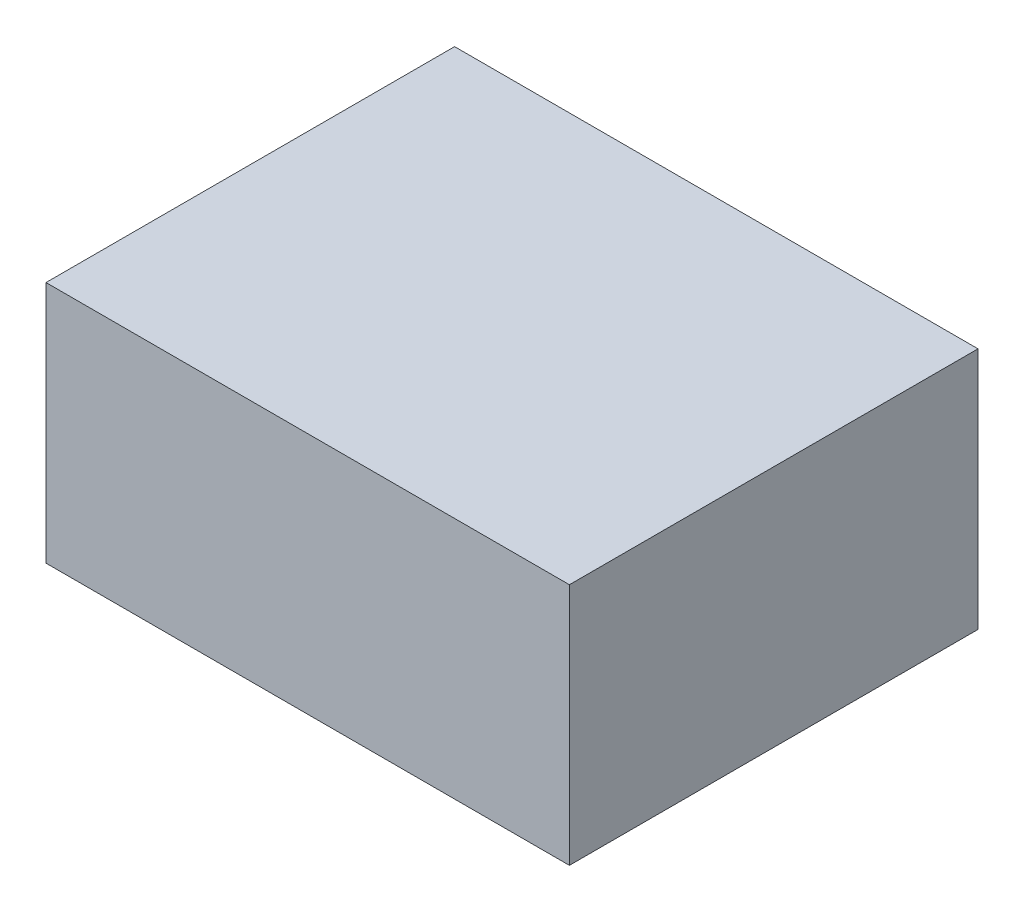
ISO-10303-21;
HEADER;
FILE_DESCRIPTION(('STEP AP214'),'2;1');
FILE_NAME('part.step','',(''),(''),'','','');
FILE_SCHEMA(('AUTOMOTIVE_DESIGN { 1 0 10303 214 1 1 1 1 }'));
ENDSEC;
DATA;
#1=APPLICATION_CONTEXT('core data for automotive mechanical design processes');
#2=APPLICATION_PROTOCOL_DEFINITION('international standard','automotive_design',2000,#1);
#3=PRODUCT_CONTEXT('',#1,'mechanical');
#4=PRODUCT('Part','Part','',(#3));
#5=PRODUCT_RELATED_PRODUCT_CATEGORY('part','',(#4));
#6=PRODUCT_DEFINITION_FORMATION('','',#4);
#7=PRODUCT_DEFINITION_CONTEXT('part definition',#1,'design');
#8=PRODUCT_DEFINITION('design','',#6,#7);
#9=PRODUCT_DEFINITION_SHAPE('','',#8);
#10=(LENGTH_UNIT() NAMED_UNIT(*) SI_UNIT(.MILLI.,.METRE.));
#11=(NAMED_UNIT(*) PLANE_ANGLE_UNIT() SI_UNIT($,.RADIAN.));
#12=(NAMED_UNIT(*) SI_UNIT($,.STERADIAN.) SOLID_ANGLE_UNIT());
#13=UNCERTAINTY_MEASURE_WITH_UNIT(LENGTH_MEASURE(1.E-05),#10,'distance_accuracy_value','');
#14=(GEOMETRIC_REPRESENTATION_CONTEXT(3) GLOBAL_UNCERTAINTY_ASSIGNED_CONTEXT((#13)) GLOBAL_UNIT_ASSIGNED_CONTEXT((#10,
#11,#12)) REPRESENTATION_CONTEXT('',''));
#15=CARTESIAN_POINT('',(0.,0.,0.));
#16=DIRECTION('',(0.,0.,1.));
#17=DIRECTION('',(1.,0.,0.));
#18=AXIS2_PLACEMENT_3D('',#15,#16,#17);
#19=CARTESIAN_POINT('',(53.8367269948878,50.,42.0286716316968));
#20=DIRECTION('',(-1.,0.,0.));
#21=DIRECTION('',(0.,0.,1.));
#22=AXIS2_PLACEMENT_3D('',#19,#20,#21);
#23=PLANE('',#22);
#24=DIRECTION('',(0.,0.,-1.));
#25=VECTOR('',#24,1.);
#26=CARTESIAN_POINT('',(53.8367269948878,0.,42.0286716316968));
#27=LINE('',#26,#25);
#28=CARTESIAN_POINT('',(53.8367269948878,0.,42.0286716316968));
#29=VERTEX_POINT('',#28);
#30=CARTESIAN_POINT('',(53.8367269948878,0.,-42.0286716316968));
#31=VERTEX_POINT('',#30);
#32=EDGE_CURVE('E107',#29,#31,#27,.T.);
#33=ORIENTED_EDGE('',*,*,#32,.T.);
#34=DIRECTION('',(0.,-1.,0.));
#35=VECTOR('',#34,1.);
#36=CARTESIAN_POINT('',(53.8367269948878,50.,-42.0286716316968));
#37=LINE('',#36,#35);
#38=CARTESIAN_POINT('',(53.8367269948878,50.,-42.0286716316968));
#39=VERTEX_POINT('',#38);
#40=EDGE_CURVE('E11',#39,#31,#37,.T.);
#41=ORIENTED_EDGE('',*,*,#40,.F.);
#42=DIRECTION('',(0.,0.,-1.));
#43=VECTOR('',#42,1.);
#44=CARTESIAN_POINT('',(53.8367269948878,50.,42.0286716316968));
#45=LINE('',#44,#43);
#46=CARTESIAN_POINT('',(53.8367269948878,50.,42.0286716316968));
#47=VERTEX_POINT('',#46);
#48=EDGE_CURVE('E91',#47,#39,#45,.T.);
#49=ORIENTED_EDGE('',*,*,#48,.F.);
#50=DIRECTION('',(0.,-1.,0.));
#51=VECTOR('',#50,1.);
#52=CARTESIAN_POINT('',(53.8367269948878,50.,42.0286716316968));
#53=LINE('',#52,#51);
#54=EDGE_CURVE('E103',#47,#29,#53,.T.);
#55=ORIENTED_EDGE('',*,*,#54,.T.);
#56=EDGE_LOOP('',(#33,#41,#49,#55));
#57=FACE_BOUND('',#56,.T.);
#58=ADVANCED_FACE('F39',(#57),#23,.F.);
#59=CARTESIAN_POINT('',(-53.8367269948878,50.,-42.0286716316968));
#60=DIRECTION('',(0.,0.,1.));
#61=DIRECTION('',(1.,0.,0.));
#62=AXIS2_PLACEMENT_3D('',#59,#60,#61);
#63=PLANE('',#62);
#64=DIRECTION('',(-1.,0.,0.));
#65=VECTOR('',#64,1.);
#66=CARTESIAN_POINT('',(-53.8367269948878,0.,-42.0286716316968));
#67=LINE('',#66,#65);
#68=CARTESIAN_POINT('',(-53.8367269948878,0.,-42.0286716316968));
#69=VERTEX_POINT('',#68);
#70=EDGE_CURVE('E96',#31,#69,#67,.T.);
#71=ORIENTED_EDGE('',*,*,#70,.T.);
#72=DIRECTION('',(0.,-1.,0.));
#73=VECTOR('',#72,1.);
#74=CARTESIAN_POINT('',(-53.8367269948878,50.,-42.0286716316968));
#75=LINE('',#74,#73);
#76=CARTESIAN_POINT('',(-53.8367269948878,50.,-42.0286716316968));
#77=VERTEX_POINT('',#76);
#78=EDGE_CURVE('E48',#77,#69,#75,.T.);
#79=ORIENTED_EDGE('',*,*,#78,.F.);
#80=DIRECTION('',(-1.,0.,0.));
#81=VECTOR('',#80,1.);
#82=CARTESIAN_POINT('',(-53.8367269948878,50.,-42.0286716316968));
#83=LINE('',#82,#81);
#84=EDGE_CURVE('E86',#39,#77,#83,.T.);
#85=ORIENTED_EDGE('',*,*,#84,.F.);
#86=ORIENTED_EDGE('',*,*,#40,.T.);
#87=EDGE_LOOP('',(#71,#79,#85,#86));
#88=FACE_BOUND('',#87,.T.);
#89=ADVANCED_FACE('F95',(#88),#63,.F.);
#90=CARTESIAN_POINT('',(-53.8367269948878,50.,42.0286716316968));
#91=DIRECTION('',(1.,0.,0.));
#92=DIRECTION('',(0.,0.,-1.));
#93=AXIS2_PLACEMENT_3D('',#90,#91,#92);
#94=PLANE('',#93);
#95=DIRECTION('',(0.,0.,1.));
#96=VECTOR('',#95,1.);
#97=CARTESIAN_POINT('',(-53.8367269948878,0.,42.0286716316968));
#98=LINE('',#97,#96);
#99=CARTESIAN_POINT('',(-53.8367269948878,0.,42.0286716316968));
#100=VERTEX_POINT('',#99);
#101=EDGE_CURVE('E73',#69,#100,#98,.T.);
#102=ORIENTED_EDGE('',*,*,#101,.T.);
#103=DIRECTION('',(0.,-1.,0.));
#104=VECTOR('',#103,1.);
#105=CARTESIAN_POINT('',(-53.8367269948878,50.,42.0286716316968));
#106=LINE('',#105,#104);
#107=CARTESIAN_POINT('',(-53.8367269948878,50.,42.0286716316968));
#108=VERTEX_POINT('',#107);
#109=EDGE_CURVE('E98',#108,#100,#106,.T.);
#110=ORIENTED_EDGE('',*,*,#109,.F.);
#111=DIRECTION('',(0.,0.,1.));
#112=VECTOR('',#111,1.);
#113=CARTESIAN_POINT('',(-53.8367269948878,50.,42.0286716316968));
#114=LINE('',#113,#112);
#115=EDGE_CURVE('E89',#77,#108,#114,.T.);
#116=ORIENTED_EDGE('',*,*,#115,.F.);
#117=ORIENTED_EDGE('',*,*,#78,.T.);
#118=EDGE_LOOP('',(#102,#110,#116,#117));
#119=FACE_BOUND('',#118,.T.);
#120=ADVANCED_FACE('F99',(#119),#94,.F.);
#121=CARTESIAN_POINT('',(-53.8367269948878,50.,42.0286716316968));
#122=DIRECTION('',(0.,0.,-1.));
#123=DIRECTION('',(-1.,0.,0.));
#124=AXIS2_PLACEMENT_3D('',#121,#122,#123);
#125=PLANE('',#124);
#126=DIRECTION('',(1.,0.,0.));
#127=VECTOR('',#126,1.);
#128=CARTESIAN_POINT('',(-53.8367269948878,0.,42.0286716316968));
#129=LINE('',#128,#127);
#130=EDGE_CURVE('E79',#100,#29,#129,.T.);
#131=ORIENTED_EDGE('',*,*,#130,.T.);
#132=ORIENTED_EDGE('',*,*,#54,.F.);
#133=DIRECTION('',(1.,0.,0.));
#134=VECTOR('',#133,1.);
#135=CARTESIAN_POINT('',(-53.8367269948878,50.,42.0286716316968));
#136=LINE('',#135,#134);
#137=EDGE_CURVE('E56',#108,#47,#136,.T.);
#138=ORIENTED_EDGE('',*,*,#137,.F.);
#139=ORIENTED_EDGE('',*,*,#109,.T.);
#140=EDGE_LOOP('',(#131,#132,#138,#139));
#141=FACE_BOUND('',#140,.T.);
#142=ADVANCED_FACE('F120',(#141),#125,.F.);
#143=CARTESIAN_POINT('',(0.,50.,0.));
#144=DIRECTION('',(0.,-1.,0.));
#145=DIRECTION('',(0.,0.,-1.));
#146=AXIS2_PLACEMENT_3D('',#143,#144,#145);
#147=PLANE('',#146);
#148=ORIENTED_EDGE('',*,*,#48,.T.);
#149=ORIENTED_EDGE('',*,*,#84,.T.);
#150=ORIENTED_EDGE('',*,*,#115,.T.);
#151=ORIENTED_EDGE('',*,*,#137,.T.);
#152=EDGE_LOOP('',(#148,#149,#150,#151));
#153=FACE_BOUND('',#152,.T.);
#154=ADVANCED_FACE('F87',(#153),#147,.F.);
#155=CARTESIAN_POINT('',(0.,0.,0.));
#156=DIRECTION('',(0.,-1.,0.));
#157=DIRECTION('',(0.,0.,-1.));
#158=AXIS2_PLACEMENT_3D('',#155,#156,#157);
#159=PLANE('',#158);
#160=ORIENTED_EDGE('',*,*,#32,.F.);
#161=ORIENTED_EDGE('',*,*,#130,.F.);
#162=ORIENTED_EDGE('',*,*,#101,.F.);
#163=ORIENTED_EDGE('',*,*,#70,.F.);
#164=EDGE_LOOP('',(#160,#161,#162,#163));
#165=FACE_BOUND('',#164,.T.);
#166=ADVANCED_FACE('F123',(#165),#159,.T.);
#167=CLOSED_SHELL('',(#58,#89,#120,#142,#154,#166));
#168=MANIFOLD_SOLID_BREP('B2',#167);
#169=ADVANCED_BREP_SHAPE_REPRESENTATION('',(#18,#168),#14);
#170=SHAPE_DEFINITION_REPRESENTATION(#9,#169);
ENDSEC;
END-ISO-10303-21;
